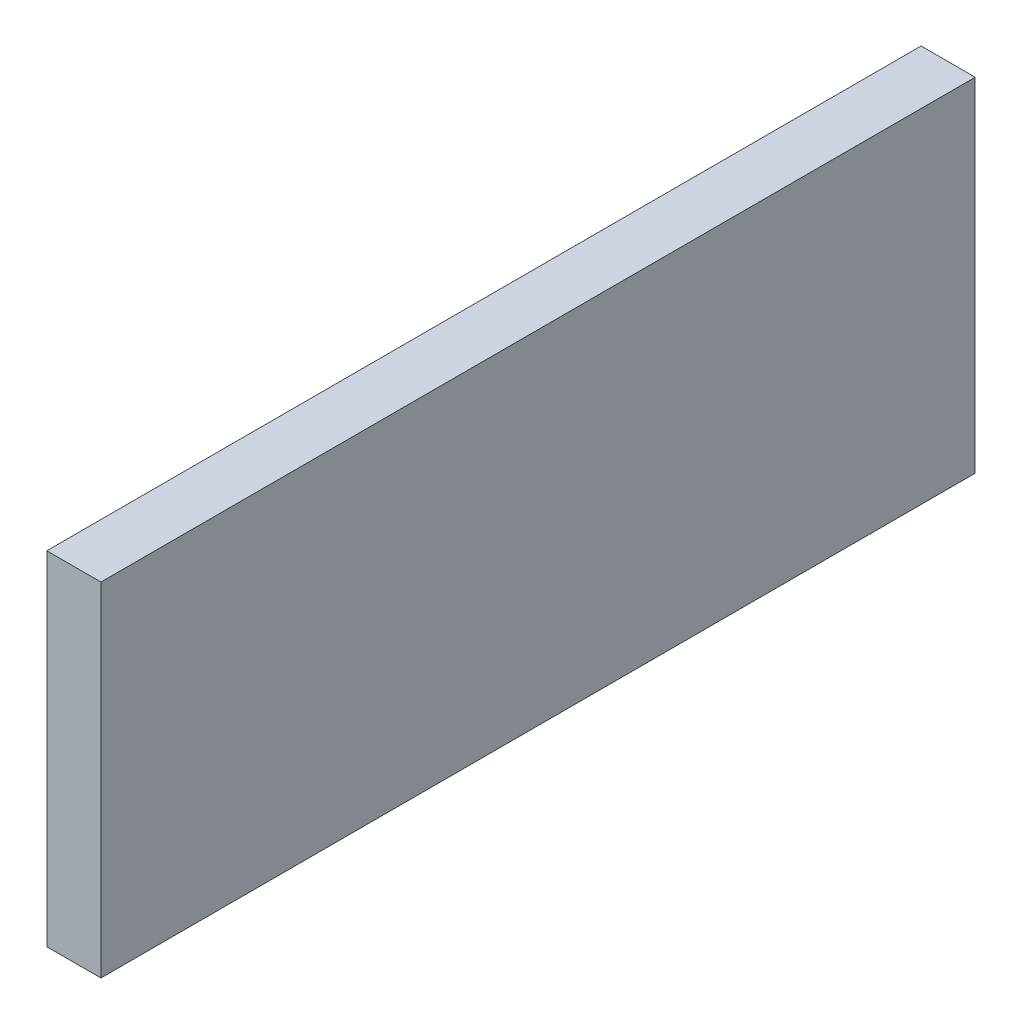
ISO-10303-21;
HEADER;
FILE_DESCRIPTION(('STEP AP214'),'2;1');
FILE_NAME('part.step','',(''),(''),'','','');
FILE_SCHEMA(('AUTOMOTIVE_DESIGN { 1 0 10303 214 1 1 1 1 }'));
ENDSEC;
DATA;
#1=APPLICATION_CONTEXT('core data for automotive mechanical design processes');
#2=APPLICATION_PROTOCOL_DEFINITION('international standard','automotive_design',2000,#1);
#3=PRODUCT_CONTEXT('',#1,'mechanical');
#4=PRODUCT('Part','Part','',(#3));
#5=PRODUCT_RELATED_PRODUCT_CATEGORY('part','',(#4));
#6=PRODUCT_DEFINITION_FORMATION('','',#4);
#7=PRODUCT_DEFINITION_CONTEXT('part definition',#1,'design');
#8=PRODUCT_DEFINITION('design','',#6,#7);
#9=PRODUCT_DEFINITION_SHAPE('','',#8);
#10=(LENGTH_UNIT() NAMED_UNIT(*) SI_UNIT(.MILLI.,.METRE.));
#11=(NAMED_UNIT(*) PLANE_ANGLE_UNIT() SI_UNIT($,.RADIAN.));
#12=(NAMED_UNIT(*) SI_UNIT($,.STERADIAN.) SOLID_ANGLE_UNIT());
#13=UNCERTAINTY_MEASURE_WITH_UNIT(LENGTH_MEASURE(1.E-05),#10,'distance_accuracy_value','');
#14=(GEOMETRIC_REPRESENTATION_CONTEXT(3) GLOBAL_UNCERTAINTY_ASSIGNED_CONTEXT((#13)) GLOBAL_UNIT_ASSIGNED_CONTEXT((#10,
#11,#12)) REPRESENTATION_CONTEXT('',''));
#15=CARTESIAN_POINT('',(0.,0.,0.));
#16=DIRECTION('',(0.,0.,1.));
#17=DIRECTION('',(1.,0.,0.));
#18=AXIS2_PLACEMENT_3D('',#15,#16,#17);
#19=CARTESIAN_POINT('',(-1160.90670186375,270.063503955337,581.165706185745));
#20=DIRECTION('',(0.,0.,-1.));
#21=DIRECTION('',(-1.,0.,0.));
#22=AXIS2_PLACEMENT_3D('',#19,#20,#21);
#23=PLANE('',#22);
#24=DIRECTION('',(0.,-1.,0.));
#25=VECTOR('',#24,1.);
#26=CARTESIAN_POINT('',(-1199.00670186375,270.063503955337,581.165706185745));
#27=LINE('',#26,#25);
#28=CARTESIAN_POINT('',(-1199.00670186375,270.063503955337,581.165706185745));
#29=VERTEX_POINT('',#28);
#30=CARTESIAN_POINT('',(-1199.00670186375,28.7635039553368,581.165706185745));
#31=VERTEX_POINT('',#30);
#32=EDGE_CURVE('E103',#29,#31,#27,.T.);
#33=ORIENTED_EDGE('',*,*,#32,.F.);
#34=DIRECTION('',(-1.,0.,0.));
#35=VECTOR('',#34,1.);
#36=CARTESIAN_POINT('',(-1160.90670186375,270.063503955337,581.165706185745));
#37=LINE('',#36,#35);
#38=CARTESIAN_POINT('',(-1160.90670186375,270.063503955337,581.165706185745));
#39=VERTEX_POINT('',#38);
#40=EDGE_CURVE('E11',#39,#29,#37,.T.);
#41=ORIENTED_EDGE('',*,*,#40,.F.);
#42=DIRECTION('',(0.,-1.,0.));
#43=VECTOR('',#42,1.);
#44=CARTESIAN_POINT('',(-1160.90670186375,270.063503955337,581.165706185745));
#45=LINE('',#44,#43);
#46=CARTESIAN_POINT('',(-1160.90670186375,28.7635039553368,581.165706185745));
#47=VERTEX_POINT('',#46);
#48=EDGE_CURVE('E97',#39,#47,#45,.T.);
#49=ORIENTED_EDGE('',*,*,#48,.T.);
#50=DIRECTION('',(-1.,0.,0.));
#51=VECTOR('',#50,1.);
#52=CARTESIAN_POINT('',(-1160.90670186375,28.7635039553368,581.165706185745));
#53=LINE('',#52,#51);
#54=EDGE_CURVE('E42',#47,#31,#53,.T.);
#55=ORIENTED_EDGE('',*,*,#54,.T.);
#56=EDGE_LOOP('',(#33,#41,#49,#55));
#57=FACE_BOUND('',#56,.T.);
#58=ADVANCED_FACE('F39',(#57),#23,.T.);
#59=CARTESIAN_POINT('',(-1160.90670186375,270.063503955337,1196.36215441038));
#60=DIRECTION('',(0.,1.,0.));
#61=DIRECTION('',(0.,0.,1.));
#62=AXIS2_PLACEMENT_3D('',#59,#60,#61);
#63=PLANE('',#62);
#64=DIRECTION('',(0.,0.,-1.));
#65=VECTOR('',#64,1.);
#66=CARTESIAN_POINT('',(-1199.00670186375,270.063503955337,1196.36215441038));
#67=LINE('',#66,#65);
#68=CARTESIAN_POINT('',(-1199.00670186375,270.063503955337,1196.36215441038));
#69=VERTEX_POINT('',#68);
#70=EDGE_CURVE('E99',#69,#29,#67,.T.);
#71=ORIENTED_EDGE('',*,*,#70,.F.);
#72=DIRECTION('',(-1.,0.,0.));
#73=VECTOR('',#72,1.);
#74=CARTESIAN_POINT('',(-1160.90670186375,270.063503955337,1196.36215441038));
#75=LINE('',#74,#73);
#76=CARTESIAN_POINT('',(-1160.90670186375,270.063503955337,1196.36215441038));
#77=VERTEX_POINT('',#76);
#78=EDGE_CURVE('E48',#77,#69,#75,.T.);
#79=ORIENTED_EDGE('',*,*,#78,.F.);
#80=DIRECTION('',(0.,0.,-1.));
#81=VECTOR('',#80,1.);
#82=CARTESIAN_POINT('',(-1160.90670186375,270.063503955337,1196.36215441038));
#83=LINE('',#82,#81);
#84=EDGE_CURVE('E94',#77,#39,#83,.T.);
#85=ORIENTED_EDGE('',*,*,#84,.T.);
#86=ORIENTED_EDGE('',*,*,#40,.T.);
#87=EDGE_LOOP('',(#71,#79,#85,#86));
#88=FACE_BOUND('',#87,.T.);
#89=ADVANCED_FACE('F113',(#88),#63,.T.);
#90=CARTESIAN_POINT('',(-1160.90670186375,28.7635039553368,1196.36215441038));
#91=DIRECTION('',(0.,0.,1.));
#92=DIRECTION('',(1.,0.,0.));
#93=AXIS2_PLACEMENT_3D('',#90,#91,#92);
#94=PLANE('',#93);
#95=DIRECTION('',(0.,1.,0.));
#96=VECTOR('',#95,1.);
#97=CARTESIAN_POINT('',(-1199.00670186375,28.7635039553368,1196.36215441038));
#98=LINE('',#97,#96);
#99=CARTESIAN_POINT('',(-1199.00670186375,28.7635039553368,1196.36215441038));
#100=VERTEX_POINT('',#99);
#101=EDGE_CURVE('E89',#100,#69,#98,.T.);
#102=ORIENTED_EDGE('',*,*,#101,.F.);
#103=DIRECTION('',(-1.,0.,0.));
#104=VECTOR('',#103,1.);
#105=CARTESIAN_POINT('',(-1160.90670186375,28.7635039553368,1196.36215441038));
#106=LINE('',#105,#104);
#107=CARTESIAN_POINT('',(-1160.90670186375,28.7635039553368,1196.36215441038));
#108=VERTEX_POINT('',#107);
#109=EDGE_CURVE('E84',#108,#100,#106,.T.);
#110=ORIENTED_EDGE('',*,*,#109,.F.);
#111=DIRECTION('',(0.,1.,0.));
#112=VECTOR('',#111,1.);
#113=CARTESIAN_POINT('',(-1160.90670186375,28.7635039553368,1196.36215441038));
#114=LINE('',#113,#112);
#115=EDGE_CURVE('E87',#108,#77,#114,.T.);
#116=ORIENTED_EDGE('',*,*,#115,.T.);
#117=ORIENTED_EDGE('',*,*,#78,.T.);
#118=EDGE_LOOP('',(#102,#110,#116,#117));
#119=FACE_BOUND('',#118,.T.);
#120=ADVANCED_FACE('F86',(#119),#94,.T.);
#121=CARTESIAN_POINT('',(-1160.90670186375,28.7635039553368,581.165706185745));
#122=DIRECTION('',(0.,-1.,0.));
#123=DIRECTION('',(0.,0.,-1.));
#124=AXIS2_PLACEMENT_3D('',#121,#122,#123);
#125=PLANE('',#124);
#126=DIRECTION('',(0.,0.,1.));
#127=VECTOR('',#126,1.);
#128=CARTESIAN_POINT('',(-1199.00670186375,28.7635039553368,581.165706185745));
#129=LINE('',#128,#127);
#130=EDGE_CURVE('E106',#31,#100,#129,.T.);
#131=ORIENTED_EDGE('',*,*,#130,.F.);
#132=ORIENTED_EDGE('',*,*,#54,.F.);
#133=DIRECTION('',(0.,0.,1.));
#134=VECTOR('',#133,1.);
#135=CARTESIAN_POINT('',(-1160.90670186375,28.7635039553368,581.165706185745));
#136=LINE('',#135,#134);
#137=EDGE_CURVE('E93',#47,#108,#136,.T.);
#138=ORIENTED_EDGE('',*,*,#137,.T.);
#139=ORIENTED_EDGE('',*,*,#109,.T.);
#140=EDGE_LOOP('',(#131,#132,#138,#139));
#141=FACE_BOUND('',#140,.T.);
#142=ADVANCED_FACE('F96',(#141),#125,.T.);
#143=CARTESIAN_POINT('',(-1160.90670186375,0.,0.));
#144=DIRECTION('',(-1.,0.,0.));
#145=DIRECTION('',(0.,0.,1.));
#146=AXIS2_PLACEMENT_3D('',#143,#144,#145);
#147=PLANE('',#146);
#148=ORIENTED_EDGE('',*,*,#48,.F.);
#149=ORIENTED_EDGE('',*,*,#84,.F.);
#150=ORIENTED_EDGE('',*,*,#115,.F.);
#151=ORIENTED_EDGE('',*,*,#137,.F.);
#152=EDGE_LOOP('',(#148,#149,#150,#151));
#153=FACE_BOUND('',#152,.T.);
#154=ADVANCED_FACE('F92',(#153),#147,.F.);
#155=CARTESIAN_POINT('',(-1199.00670186375,0.,0.));
#156=DIRECTION('',(-1.,0.,0.));
#157=DIRECTION('',(0.,0.,1.));
#158=AXIS2_PLACEMENT_3D('',#155,#156,#157);
#159=PLANE('',#158);
#160=ORIENTED_EDGE('',*,*,#32,.T.);
#161=ORIENTED_EDGE('',*,*,#130,.T.);
#162=ORIENTED_EDGE('',*,*,#101,.T.);
#163=ORIENTED_EDGE('',*,*,#70,.T.);
#164=EDGE_LOOP('',(#160,#161,#162,#163));
#165=FACE_BOUND('',#164,.T.);
#166=ADVANCED_FACE('F112',(#165),#159,.T.);
#167=CLOSED_SHELL('',(#58,#89,#120,#142,#154,#166));
#168=MANIFOLD_SOLID_BREP('B2',#167);
#169=ADVANCED_BREP_SHAPE_REPRESENTATION('',(#18,#168),#14);
#170=SHAPE_DEFINITION_REPRESENTATION(#9,#169);
ENDSEC;
END-ISO-10303-21;
